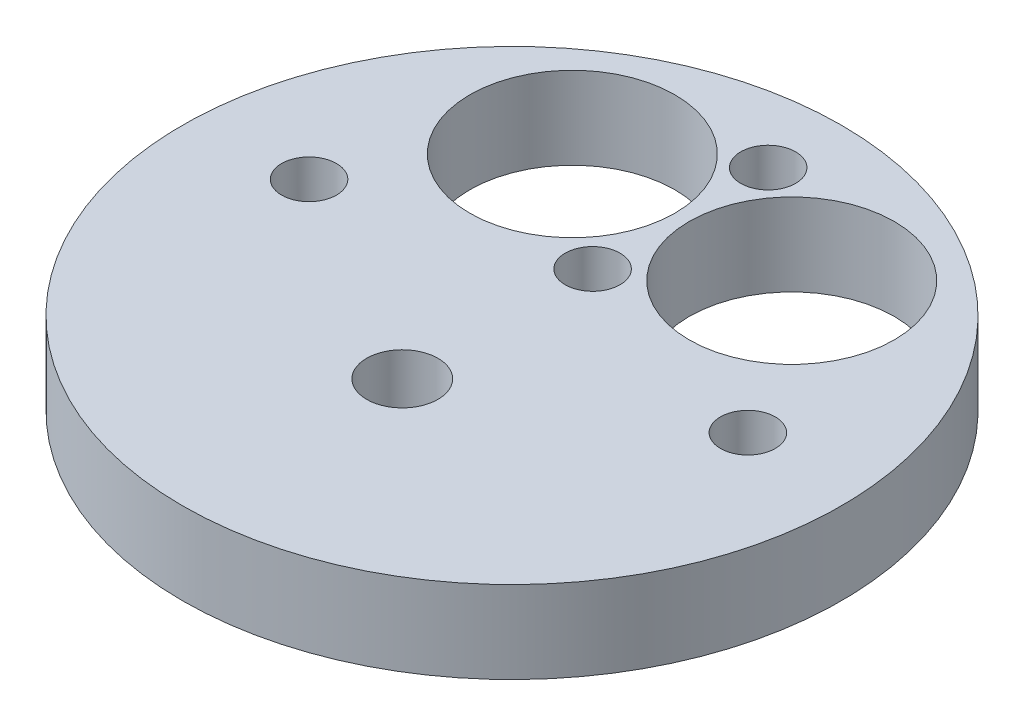
ISO-10303-21;
HEADER;
FILE_DESCRIPTION(('STEP AP214'),'2;1');
FILE_NAME('part.step','',(''),(''),'','','');
FILE_SCHEMA(('AUTOMOTIVE_DESIGN { 1 0 10303 214 1 1 1 1 }'));
ENDSEC;
DATA;
#1=APPLICATION_CONTEXT('core data for automotive mechanical design processes');
#2=APPLICATION_PROTOCOL_DEFINITION('international standard','automotive_design',2000,#1);
#3=PRODUCT_CONTEXT('',#1,'mechanical');
#4=PRODUCT('Part','Part','',(#3));
#5=PRODUCT_RELATED_PRODUCT_CATEGORY('part','',(#4));
#6=PRODUCT_DEFINITION_FORMATION('','',#4);
#7=PRODUCT_DEFINITION_CONTEXT('part definition',#1,'design');
#8=PRODUCT_DEFINITION('design','',#6,#7);
#9=PRODUCT_DEFINITION_SHAPE('','',#8);
#10=(LENGTH_UNIT() NAMED_UNIT(*) SI_UNIT(.MILLI.,.METRE.));
#11=(NAMED_UNIT(*) PLANE_ANGLE_UNIT() SI_UNIT($,.RADIAN.));
#12=(NAMED_UNIT(*) SI_UNIT($,.STERADIAN.) SOLID_ANGLE_UNIT());
#13=UNCERTAINTY_MEASURE_WITH_UNIT(LENGTH_MEASURE(1.E-05),#10,'distance_accuracy_value','');
#14=(GEOMETRIC_REPRESENTATION_CONTEXT(3) GLOBAL_UNCERTAINTY_ASSIGNED_CONTEXT((#13)) GLOBAL_UNIT_ASSIGNED_CONTEXT((#10,
#11,#12)) REPRESENTATION_CONTEXT('',''));
#15=CARTESIAN_POINT('',(0.,0.,0.));
#16=DIRECTION('',(0.,0.,1.));
#17=DIRECTION('',(1.,0.,0.));
#18=AXIS2_PLACEMENT_3D('',#15,#16,#17);
#19=CARTESIAN_POINT('',(0.,9.525,0.));
#20=DIRECTION('',(0.,-1.,0.));
#21=DIRECTION('',(0.,0.,-1.));
#22=AXIS2_PLACEMENT_3D('',#19,#20,#21);
#23=CYLINDRICAL_SURFACE('',#22,38.1508);
#24=CARTESIAN_POINT('',(0.,9.525,0.));
#25=DIRECTION('',(0.,1.,0.));
#26=DIRECTION('',(0.,0.,1.));
#27=AXIS2_PLACEMENT_3D('',#24,#25,#26);
#28=CIRCLE('',#27,38.1508);
#29=CARTESIAN_POINT('',(0.,9.525,-38.1508));
#30=VERTEX_POINT('',#29);
#31=EDGE_CURVE('E10',#30,#30,#28,.T.);
#32=CARTESIAN_POINT('',(0.,0.,0.));
#33=DIRECTION('',(0.,1.,0.));
#34=DIRECTION('',(0.,0.,1.));
#35=AXIS2_PLACEMENT_3D('',#32,#33,#34);
#36=CIRCLE('',#35,38.1508);
#37=CARTESIAN_POINT('',(0.,0.,-38.1508));
#38=VERTEX_POINT('',#37);
#39=EDGE_CURVE('E44',#38,#38,#36,.T.);
#40=CARTESIAN_POINT('',(0.,9.525,-38.1508));
#41=CARTESIAN_POINT('',(0.,9.42578125,-38.1508));
#42=CARTESIAN_POINT('',(0.,9.3265625,-38.1508));
#43=CARTESIAN_POINT('',(0.,9.128125,-38.1508));
#44=CARTESIAN_POINT('',(0.,9.02890625,-38.1508));
#45=CARTESIAN_POINT('',(0.,8.83046875,-38.1508));
#46=CARTESIAN_POINT('',(0.,8.73125,-38.1508));
#47=CARTESIAN_POINT('',(0.,8.5328125,-38.1508));
#48=CARTESIAN_POINT('',(0.,8.43359375,-38.1508));
#49=CARTESIAN_POINT('',(0.,8.23515625,-38.1508));
#50=CARTESIAN_POINT('',(0.,8.1359375,-38.1508));
#51=CARTESIAN_POINT('',(0.,7.9375,-38.1508));
#52=CARTESIAN_POINT('',(0.,7.83828125,-38.1508));
#53=CARTESIAN_POINT('',(0.,7.63984375,-38.1508));
#54=CARTESIAN_POINT('',(0.,7.540625,-38.1508));
#55=CARTESIAN_POINT('',(0.,7.3421875,-38.1508));
#56=CARTESIAN_POINT('',(0.,7.24296875,-38.1508));
#57=CARTESIAN_POINT('',(0.,7.04453125,-38.1508));
#58=CARTESIAN_POINT('',(0.,6.9453125,-38.1508));
#59=CARTESIAN_POINT('',(0.,6.746875,-38.1508));
#60=CARTESIAN_POINT('',(0.,6.64765625,-38.1508));
#61=CARTESIAN_POINT('',(0.,6.44921875,-38.1508));
#62=CARTESIAN_POINT('',(0.,6.35,-38.1508));
#63=CARTESIAN_POINT('',(0.,6.1515625,-38.1508));
#64=CARTESIAN_POINT('',(0.,6.05234375,-38.1508));
#65=CARTESIAN_POINT('',(0.,5.85390625,-38.1508));
#66=CARTESIAN_POINT('',(0.,5.7546875,-38.1508));
#67=CARTESIAN_POINT('',(0.,5.55625,-38.1508));
#68=CARTESIAN_POINT('',(0.,5.45703125,-38.1508));
#69=CARTESIAN_POINT('',(0.,5.25859375,-38.1508));
#70=CARTESIAN_POINT('',(0.,5.159375,-38.1508));
#71=CARTESIAN_POINT('',(0.,4.9609375,-38.1508));
#72=CARTESIAN_POINT('',(0.,4.86171875,-38.1508));
#73=CARTESIAN_POINT('',(0.,4.66328125,-38.1508));
#74=CARTESIAN_POINT('',(0.,4.5640625,-38.1508));
#75=CARTESIAN_POINT('',(0.,4.365625,-38.1508));
#76=CARTESIAN_POINT('',(0.,4.26640625,-38.1508));
#77=CARTESIAN_POINT('',(0.,4.06796875,-38.1508));
#78=CARTESIAN_POINT('',(0.,3.96875,-38.1508));
#79=CARTESIAN_POINT('',(0.,3.7703125,-38.1508));
#80=CARTESIAN_POINT('',(0.,3.67109375,-38.1508));
#81=CARTESIAN_POINT('',(0.,3.47265625,-38.1508));
#82=CARTESIAN_POINT('',(0.,3.3734375,-38.1508));
#83=CARTESIAN_POINT('',(0.,3.175,-38.1508));
#84=CARTESIAN_POINT('',(0.,3.07578125,-38.1508));
#85=CARTESIAN_POINT('',(0.,2.87734375,-38.1508));
#86=CARTESIAN_POINT('',(0.,2.778125,-38.1508));
#87=CARTESIAN_POINT('',(0.,2.5796875,-38.1508));
#88=CARTESIAN_POINT('',(0.,2.48046875,-38.1508));
#89=CARTESIAN_POINT('',(0.,2.28203125,-38.1508));
#90=CARTESIAN_POINT('',(0.,2.1828125,-38.1508));
#91=CARTESIAN_POINT('',(0.,1.984375,-38.1508));
#92=CARTESIAN_POINT('',(0.,1.88515625,-38.1508));
#93=CARTESIAN_POINT('',(0.,1.68671875,-38.1508));
#94=CARTESIAN_POINT('',(0.,1.5875,-38.1508));
#95=CARTESIAN_POINT('',(0.,1.3890625,-38.1508));
#96=CARTESIAN_POINT('',(0.,1.28984375,-38.1508));
#97=CARTESIAN_POINT('',(0.,1.09140625,-38.1508));
#98=CARTESIAN_POINT('',(0.,0.992187500000001,-38.1508));
#99=CARTESIAN_POINT('',(0.,0.793750000000001,-38.1508));
#100=CARTESIAN_POINT('',(0.,0.69453125,-38.1508));
#101=CARTESIAN_POINT('',(0.,0.49609375,-38.1508));
#102=CARTESIAN_POINT('',(0.,0.396875,-38.1508));
#103=CARTESIAN_POINT('',(0.,0.1984375,-38.1508));
#104=CARTESIAN_POINT('',(0.,0.0992187500000001,-38.1508));
#105=CARTESIAN_POINT('',(0.,0.,-38.1508));
#106=B_SPLINE_CURVE_WITH_KNOTS('',3,(#40,#41,#42,#43,#44,#45,#46,#47,#48,#49,#50,#51,#52,#53,
#54,#55,#56,#57,#58,#59,#60,#61,#62,#63,#64,#65,#66,#67,#68,#69,#70,#71,#72,#73,#74,#75,#76,#77,
#78,#79,#80,#81,#82,#83,#84,#85,#86,#87,#88,#89,#90,#91,#92,#93,#94,#95,#96,#97,#98,#99,#100,
#101,#102,#103,#104,#105),.UNSPECIFIED.,.F.,.F.,(4,2,2,2,2,2,2,2,2,2,2,2,2,2,2,2,2,2,2,2,2,2,2,
2,2,2,2,2,2,2,2,2,4),(0.,0.297656249999998,0.595312499999999,0.892968749999999,1.190625,
1.48828125,1.7859375,2.08359375,2.38125,2.67890625,2.9765625,3.27421875,3.571875,3.86953125,
4.1671875,4.46484375,4.7625,5.06015625,5.3578125,5.65546875,5.953125,6.25078125,6.5484375,
6.84609375,7.14375,7.44140625,7.7390625,8.03671875,8.334375,8.63203125,8.9296875,9.22734375,
9.525),.UNSPECIFIED.);
#107=EDGE_CURVE('BSEAM37',#30,#38,#106,.T.);
#108=ORIENTED_EDGE('',*,*,#31,.F.);
#109=ORIENTED_EDGE('',*,*,#39,.T.);
#110=ORIENTED_EDGE('',*,*,#107,.T.);
#111=ORIENTED_EDGE('',*,*,#107,.F.);
#112=EDGE_LOOP('',(#108,#110,#109,#111));
#113=FACE_BOUND('',#112,.T.);
#114=ADVANCED_FACE('F37',(#113),#23,.T.);
#115=CARTESIAN_POINT('',(0.,9.525,0.));
#116=DIRECTION('',(0.,1.,0.));
#117=DIRECTION('',(0.,0.,1.));
#118=AXIS2_PLACEMENT_3D('',#115,#116,#117);
#119=PLANE('',#118);
#120=CARTESIAN_POINT('',(0.,9.525,12.7));
#121=DIRECTION('',(0.,1.,0.));
#122=DIRECTION('',(0.,0.,1.));
#123=AXIS2_PLACEMENT_3D('',#120,#121,#122);
#124=CIRCLE('',#123,4.1275);
#125=CARTESIAN_POINT('',(0.,9.525,16.8275));
#126=VERTEX_POINT('',#125);
#127=EDGE_CURVE('E81',#126,#126,#124,.T.);
#128=ORIENTED_EDGE('',*,*,#127,.F.);
#129=EDGE_LOOP('',(#128));
#130=FACE_BOUND('',#129,.T.);
#131=CARTESIAN_POINT('',(25.4,9.525,-1.905));
#132=DIRECTION('',(0.,1.,0.));
#133=DIRECTION('',(0.,0.,1.));
#134=AXIS2_PLACEMENT_3D('',#131,#132,#133);
#135=CIRCLE('',#134,3.175);
#136=CARTESIAN_POINT('',(25.4,9.525,1.27));
#137=VERTEX_POINT('',#136);
#138=EDGE_CURVE('E67',#137,#137,#135,.T.);
#139=ORIENTED_EDGE('',*,*,#138,.F.);
#140=EDGE_LOOP('',(#139));
#141=FACE_BOUND('',#140,.T.);
#142=CARTESIAN_POINT('',(-25.4,9.525,-1.905));
#143=DIRECTION('',(0.,1.,0.));
#144=DIRECTION('',(0.,0.,-1.));
#145=AXIS2_PLACEMENT_3D('',#142,#143,#144);
#146=CIRCLE('',#145,3.175);
#147=CARTESIAN_POINT('',(-25.4,9.525,-5.08));
#148=VERTEX_POINT('',#147);
#149=EDGE_CURVE('E73',#148,#148,#146,.T.);
#150=ORIENTED_EDGE('',*,*,#149,.F.);
#151=EDGE_LOOP('',(#150));
#152=FACE_BOUND('',#151,.T.);
#153=CARTESIAN_POINT('',(0.,9.525,-29.6540115119919));
#154=DIRECTION('',(0.,1.,0.));
#155=DIRECTION('',(0.,0.,1.));
#156=AXIS2_PLACEMENT_3D('',#153,#154,#155);
#157=CIRCLE('',#156,3.175);
#158=CARTESIAN_POINT('',(0.,9.525,-26.4790115119919));
#159=VERTEX_POINT('',#158);
#160=EDGE_CURVE('E86',#159,#159,#157,.T.);
#161=ORIENTED_EDGE('',*,*,#160,.F.);
#162=EDGE_LOOP('',(#161));
#163=FACE_BOUND('',#162,.T.);
#164=CARTESIAN_POINT('',(12.7,9.525,-19.685));
#165=DIRECTION('',(0.,1.,0.));
#166=DIRECTION('',(0.,0.,1.));
#167=AXIS2_PLACEMENT_3D('',#164,#165,#166);
#168=CIRCLE('',#167,11.8745);
#169=CARTESIAN_POINT('',(12.7,9.525,-7.8105));
#170=VERTEX_POINT('',#169);
#171=EDGE_CURVE('E88',#170,#170,#168,.T.);
#172=ORIENTED_EDGE('',*,*,#171,.F.);
#173=EDGE_LOOP('',(#172));
#174=FACE_BOUND('',#173,.T.);
#175=CARTESIAN_POINT('',(0.,9.525,-9.33401151199186));
#176=DIRECTION('',(0.,1.,0.));
#177=DIRECTION('',(0.,0.,1.));
#178=AXIS2_PLACEMENT_3D('',#175,#176,#177);
#179=CIRCLE('',#178,3.175);
#180=CARTESIAN_POINT('',(0.,9.525,-6.15901151199185));
#181=VERTEX_POINT('',#180);
#182=EDGE_CURVE('E71',#181,#181,#179,.T.);
#183=ORIENTED_EDGE('',*,*,#182,.F.);
#184=EDGE_LOOP('',(#183));
#185=FACE_BOUND('',#184,.T.);
#186=CARTESIAN_POINT('',(-12.7,9.525,-19.685));
#187=DIRECTION('',(0.,1.,0.));
#188=DIRECTION('',(0.,0.,1.));
#189=AXIS2_PLACEMENT_3D('',#186,#187,#188);
#190=CIRCLE('',#189,11.8745);
#191=CARTESIAN_POINT('',(-12.7,9.525,-7.8105));
#192=VERTEX_POINT('',#191);
#193=EDGE_CURVE('E52',#192,#192,#190,.T.);
#194=ORIENTED_EDGE('',*,*,#193,.F.);
#195=EDGE_LOOP('',(#194));
#196=FACE_BOUND('',#195,.T.);
#197=ORIENTED_EDGE('',*,*,#31,.T.);
#198=EDGE_LOOP('',(#197));
#199=FACE_BOUND('',#198,.T.);
#200=ADVANCED_FACE('F98',(#130,#141,#152,#163,#174,#185,#196,#199),#119,.T.);
#201=CARTESIAN_POINT('',(0.,0.,0.));
#202=DIRECTION('',(0.,1.,0.));
#203=DIRECTION('',(0.,0.,1.));
#204=AXIS2_PLACEMENT_3D('',#201,#202,#203);
#205=PLANE('',#204);
#206=CARTESIAN_POINT('',(0.,0.,12.7));
#207=DIRECTION('',(0.,1.,0.));
#208=DIRECTION('',(0.,0.,1.));
#209=AXIS2_PLACEMENT_3D('',#206,#207,#208);
#210=CIRCLE('',#209,4.1275);
#211=CARTESIAN_POINT('',(0.,0.,16.8275));
#212=VERTEX_POINT('',#211);
#213=EDGE_CURVE('E78',#212,#212,#210,.T.);
#214=ORIENTED_EDGE('',*,*,#213,.T.);
#215=EDGE_LOOP('',(#214));
#216=FACE_BOUND('',#215,.T.);
#217=CARTESIAN_POINT('',(25.4,0.,-1.905));
#218=DIRECTION('',(0.,1.,0.));
#219=DIRECTION('',(0.,0.,1.));
#220=AXIS2_PLACEMENT_3D('',#217,#218,#219);
#221=CIRCLE('',#220,3.175);
#222=CARTESIAN_POINT('',(25.4,0.,1.27));
#223=VERTEX_POINT('',#222);
#224=EDGE_CURVE('E40',#223,#223,#221,.T.);
#225=ORIENTED_EDGE('',*,*,#224,.T.);
#226=EDGE_LOOP('',(#225));
#227=FACE_BOUND('',#226,.T.);
#228=CARTESIAN_POINT('',(-25.4,0.,-1.905));
#229=DIRECTION('',(0.,1.,0.));
#230=DIRECTION('',(0.,0.,1.));
#231=AXIS2_PLACEMENT_3D('',#228,#229,#230);
#232=CIRCLE('',#231,3.175);
#233=CARTESIAN_POINT('',(-25.4,0.,1.27));
#234=VERTEX_POINT('',#233);
#235=EDGE_CURVE('E65',#234,#234,#232,.T.);
#236=ORIENTED_EDGE('',*,*,#235,.T.);
#237=EDGE_LOOP('',(#236));
#238=FACE_BOUND('',#237,.T.);
#239=CARTESIAN_POINT('',(0.,0.,-29.6540115119919));
#240=DIRECTION('',(0.,1.,0.));
#241=DIRECTION('',(0.,0.,1.));
#242=AXIS2_PLACEMENT_3D('',#239,#240,#241);
#243=CIRCLE('',#242,3.175);
#244=CARTESIAN_POINT('',(0.,0.,-26.4790115119919));
#245=VERTEX_POINT('',#244);
#246=EDGE_CURVE('E49',#245,#245,#243,.T.);
#247=ORIENTED_EDGE('',*,*,#246,.T.);
#248=EDGE_LOOP('',(#247));
#249=FACE_BOUND('',#248,.T.);
#250=CARTESIAN_POINT('',(12.7,0.,-19.685));
#251=DIRECTION('',(0.,1.,0.));
#252=DIRECTION('',(0.,0.,1.));
#253=AXIS2_PLACEMENT_3D('',#250,#251,#252);
#254=CIRCLE('',#253,11.8745);
#255=CARTESIAN_POINT('',(12.7,0.,-7.8105));
#256=VERTEX_POINT('',#255);
#257=EDGE_CURVE('E61',#256,#256,#254,.T.);
#258=ORIENTED_EDGE('',*,*,#257,.T.);
#259=EDGE_LOOP('',(#258));
#260=FACE_BOUND('',#259,.T.);
#261=CARTESIAN_POINT('',(0.,0.,-9.33401151199186));
#262=DIRECTION('',(0.,1.,0.));
#263=DIRECTION('',(0.,0.,1.));
#264=AXIS2_PLACEMENT_3D('',#261,#262,#263);
#265=CIRCLE('',#264,3.175);
#266=CARTESIAN_POINT('',(0.,0.,-6.15901151199185));
#267=VERTEX_POINT('',#266);
#268=EDGE_CURVE('E58',#267,#267,#265,.T.);
#269=ORIENTED_EDGE('',*,*,#268,.T.);
#270=EDGE_LOOP('',(#269));
#271=FACE_BOUND('',#270,.T.);
#272=CARTESIAN_POINT('',(-12.7,0.,-19.685));
#273=DIRECTION('',(0.,1.,0.));
#274=DIRECTION('',(0.,0.,1.));
#275=AXIS2_PLACEMENT_3D('',#272,#273,#274);
#276=CIRCLE('',#275,11.8745);
#277=CARTESIAN_POINT('',(-12.7,0.,-7.8105));
#278=VERTEX_POINT('',#277);
#279=EDGE_CURVE('E55',#278,#278,#276,.T.);
#280=ORIENTED_EDGE('',*,*,#279,.T.);
#281=EDGE_LOOP('',(#280));
#282=FACE_BOUND('',#281,.T.);
#283=ORIENTED_EDGE('',*,*,#39,.F.);
#284=EDGE_LOOP('',(#283));
#285=FACE_BOUND('',#284,.T.);
#286=ADVANCED_FACE('F100',(#216,#227,#238,#249,#260,#271,#282,#285),#205,.F.);
#287=CARTESIAN_POINT('',(-12.7,-7.239,-19.685));
#288=DIRECTION('',(0.,1.,0.));
#289=DIRECTION('',(0.,0.,1.));
#290=AXIS2_PLACEMENT_3D('',#287,#288,#289);
#291=CYLINDRICAL_SURFACE('',#290,11.8745);
#292=ORIENTED_EDGE('',*,*,#193,.T.);
#293=EDGE_LOOP('',(#292));
#294=FACE_BOUND('',#293,.T.);
#295=ORIENTED_EDGE('',*,*,#279,.F.);
#296=EDGE_LOOP('',(#295));
#297=FACE_BOUND('',#296,.T.);
#298=ADVANCED_FACE('F95',(#294,#297),#291,.F.);
#299=CARTESIAN_POINT('',(0.,-7.239,-9.33401151199186));
#300=DIRECTION('',(0.,1.,0.));
#301=DIRECTION('',(0.,0.,1.));
#302=AXIS2_PLACEMENT_3D('',#299,#300,#301);
#303=CYLINDRICAL_SURFACE('',#302,3.175);
#304=ORIENTED_EDGE('',*,*,#182,.T.);
#305=EDGE_LOOP('',(#304));
#306=FACE_BOUND('',#305,.T.);
#307=ORIENTED_EDGE('',*,*,#268,.F.);
#308=EDGE_LOOP('',(#307));
#309=FACE_BOUND('',#308,.T.);
#310=ADVANCED_FACE('F115',(#306,#309),#303,.F.);
#311=CARTESIAN_POINT('',(12.7,-7.239,-19.685));
#312=DIRECTION('',(0.,1.,0.));
#313=DIRECTION('',(0.,0.,1.));
#314=AXIS2_PLACEMENT_3D('',#311,#312,#313);
#315=CYLINDRICAL_SURFACE('',#314,11.8745);
#316=ORIENTED_EDGE('',*,*,#171,.T.);
#317=EDGE_LOOP('',(#316));
#318=FACE_BOUND('',#317,.T.);
#319=ORIENTED_EDGE('',*,*,#257,.F.);
#320=EDGE_LOOP('',(#319));
#321=FACE_BOUND('',#320,.T.);
#322=ADVANCED_FACE('F116',(#318,#321),#315,.F.);
#323=CARTESIAN_POINT('',(0.,-7.239,-29.6540115119919));
#324=DIRECTION('',(0.,1.,0.));
#325=DIRECTION('',(0.,0.,1.));
#326=AXIS2_PLACEMENT_3D('',#323,#324,#325);
#327=CYLINDRICAL_SURFACE('',#326,3.175);
#328=ORIENTED_EDGE('',*,*,#160,.T.);
#329=EDGE_LOOP('',(#328));
#330=FACE_BOUND('',#329,.T.);
#331=ORIENTED_EDGE('',*,*,#246,.F.);
#332=EDGE_LOOP('',(#331));
#333=FACE_BOUND('',#332,.T.);
#334=ADVANCED_FACE('F119',(#330,#333),#327,.F.);
#335=CARTESIAN_POINT('',(-25.4,-7.239,-1.905));
#336=DIRECTION('',(0.,1.,0.));
#337=DIRECTION('',(0.,0.,1.));
#338=AXIS2_PLACEMENT_3D('',#335,#336,#337);
#339=CYLINDRICAL_SURFACE('',#338,3.175);
#340=ORIENTED_EDGE('',*,*,#149,.T.);
#341=EDGE_LOOP('',(#340));
#342=FACE_BOUND('',#341,.T.);
#343=ORIENTED_EDGE('',*,*,#235,.F.);
#344=EDGE_LOOP('',(#343));
#345=FACE_BOUND('',#344,.T.);
#346=ADVANCED_FACE('F122',(#342,#345),#339,.F.);
#347=CARTESIAN_POINT('',(25.4,-7.239,-1.905));
#348=DIRECTION('',(0.,1.,0.));
#349=DIRECTION('',(0.,0.,1.));
#350=AXIS2_PLACEMENT_3D('',#347,#348,#349);
#351=CYLINDRICAL_SURFACE('',#350,3.175);
#352=ORIENTED_EDGE('',*,*,#138,.T.);
#353=EDGE_LOOP('',(#352));
#354=FACE_BOUND('',#353,.T.);
#355=ORIENTED_EDGE('',*,*,#224,.F.);
#356=EDGE_LOOP('',(#355));
#357=FACE_BOUND('',#356,.T.);
#358=ADVANCED_FACE('F129',(#354,#357),#351,.F.);
#359=CARTESIAN_POINT('',(0.,0.,12.7));
#360=DIRECTION('',(0.,1.,0.));
#361=DIRECTION('',(0.,0.,1.));
#362=AXIS2_PLACEMENT_3D('',#359,#360,#361);
#363=CYLINDRICAL_SURFACE('',#362,4.1275);
#364=CARTESIAN_POINT('',(0.,0.,16.8275));
#365=CARTESIAN_POINT('',(0.,0.0992187499999999,16.8275));
#366=CARTESIAN_POINT('',(0.,0.1984375,16.8275));
#367=CARTESIAN_POINT('',(0.,0.396875,16.8275));
#368=CARTESIAN_POINT('',(0.,0.49609375,16.8275));
#369=CARTESIAN_POINT('',(0.,0.69453125,16.8275));
#370=CARTESIAN_POINT('',(0.,0.79375,16.8275));
#371=CARTESIAN_POINT('',(0.,0.9921875,16.8275));
#372=CARTESIAN_POINT('',(0.,1.09140625,16.8275));
#373=CARTESIAN_POINT('',(0.,1.28984375,16.8275));
#374=CARTESIAN_POINT('',(0.,1.3890625,16.8275));
#375=CARTESIAN_POINT('',(0.,1.5875,16.8275));
#376=CARTESIAN_POINT('',(0.,1.68671875,16.8275));
#377=CARTESIAN_POINT('',(0.,1.88515625,16.8275));
#378=CARTESIAN_POINT('',(0.,1.984375,16.8275));
#379=CARTESIAN_POINT('',(0.,2.1828125,16.8275));
#380=CARTESIAN_POINT('',(0.,2.28203125,16.8275));
#381=CARTESIAN_POINT('',(0.,2.48046875,16.8275));
#382=CARTESIAN_POINT('',(0.,2.5796875,16.8275));
#383=CARTESIAN_POINT('',(0.,2.778125,16.8275));
#384=CARTESIAN_POINT('',(0.,2.87734375,16.8275));
#385=CARTESIAN_POINT('',(0.,3.07578125,16.8275));
#386=CARTESIAN_POINT('',(0.,3.175,16.8275));
#387=CARTESIAN_POINT('',(0.,3.3734375,16.8275));
#388=CARTESIAN_POINT('',(0.,3.47265625,16.8275));
#389=CARTESIAN_POINT('',(0.,3.67109375,16.8275));
#390=CARTESIAN_POINT('',(0.,3.7703125,16.8275));
#391=CARTESIAN_POINT('',(0.,3.96875,16.8275));
#392=CARTESIAN_POINT('',(0.,4.06796875,16.8275));
#393=CARTESIAN_POINT('',(0.,4.26640625,16.8275));
#394=CARTESIAN_POINT('',(0.,4.365625,16.8275));
#395=CARTESIAN_POINT('',(0.,4.5640625,16.8275));
#396=CARTESIAN_POINT('',(0.,4.66328125,16.8275));
#397=CARTESIAN_POINT('',(0.,4.86171875,16.8275));
#398=CARTESIAN_POINT('',(0.,4.9609375,16.8275));
#399=CARTESIAN_POINT('',(0.,5.159375,16.8275));
#400=CARTESIAN_POINT('',(0.,5.25859375,16.8275));
#401=CARTESIAN_POINT('',(0.,5.45703125,16.8275));
#402=CARTESIAN_POINT('',(0.,5.55625,16.8275));
#403=CARTESIAN_POINT('',(0.,5.7546875,16.8275));
#404=CARTESIAN_POINT('',(0.,5.85390625,16.8275));
#405=CARTESIAN_POINT('',(0.,6.05234375,16.8275));
#406=CARTESIAN_POINT('',(0.,6.1515625,16.8275));
#407=CARTESIAN_POINT('',(0.,6.35,16.8275));
#408=CARTESIAN_POINT('',(0.,6.44921875,16.8275));
#409=CARTESIAN_POINT('',(0.,6.64765625,16.8275));
#410=CARTESIAN_POINT('',(0.,6.746875,16.8275));
#411=CARTESIAN_POINT('',(0.,6.9453125,16.8275));
#412=CARTESIAN_POINT('',(0.,7.04453125,16.8275));
#413=CARTESIAN_POINT('',(0.,7.24296875,16.8275));
#414=CARTESIAN_POINT('',(0.,7.3421875,16.8275));
#415=CARTESIAN_POINT('',(0.,7.540625,16.8275));
#416=CARTESIAN_POINT('',(0.,7.63984375,16.8275));
#417=CARTESIAN_POINT('',(0.,7.83828125,16.8275));
#418=CARTESIAN_POINT('',(0.,7.9375,16.8275));
#419=CARTESIAN_POINT('',(0.,8.1359375,16.8275));
#420=CARTESIAN_POINT('',(0.,8.23515625,16.8275));
#421=CARTESIAN_POINT('',(0.,8.43359375,16.8275));
#422=CARTESIAN_POINT('',(0.,8.5328125,16.8275));
#423=CARTESIAN_POINT('',(0.,8.73125,16.8275));
#424=CARTESIAN_POINT('',(0.,8.83046875,16.8275));
#425=CARTESIAN_POINT('',(0.,9.02890625,16.8275));
#426=CARTESIAN_POINT('',(0.,9.128125,16.8275));
#427=CARTESIAN_POINT('',(0.,9.3265625,16.8275));
#428=CARTESIAN_POINT('',(0.,9.42578125,16.8275));
#429=CARTESIAN_POINT('',(0.,9.525,16.8275));
#430=B_SPLINE_CURVE_WITH_KNOTS('',3,(#364,#365,#366,#367,#368,#369,#370,#371,#372,#373,#374,
#375,#376,#377,#378,#379,#380,#381,#382,#383,#384,#385,#386,#387,#388,#389,#390,#391,#392,#393,
#394,#395,#396,#397,#398,#399,#400,#401,#402,#403,#404,#405,#406,#407,#408,#409,#410,#411,#412,
#413,#414,#415,#416,#417,#418,#419,#420,#421,#422,#423,#424,#425,#426,#427,#428,#429),
.UNSPECIFIED.,.F.,.F.,(4,2,2,2,2,2,2,2,2,2,2,2,2,2,2,2,2,2,2,2,2,2,2,2,2,2,2,2,2,2,2,2,4),(0.,
0.29765625,0.5953125,0.89296875,1.190625,1.48828125,1.7859375,2.08359375,2.38125,2.67890625,
2.9765625,3.27421875,3.571875,3.86953125,4.1671875,4.46484375,4.7625,5.06015625,5.3578125,
5.65546875,5.953125,6.25078125,6.5484375,6.84609375,7.14375,7.44140625,7.7390625,8.03671875,
8.334375,8.63203125,8.9296875,9.22734375,9.525),.UNSPECIFIED.);
#431=EDGE_CURVE('BSEAM133',#212,#126,#430,.T.);
#432=ORIENTED_EDGE('',*,*,#213,.F.);
#433=ORIENTED_EDGE('',*,*,#127,.T.);
#434=ORIENTED_EDGE('',*,*,#431,.T.);
#435=ORIENTED_EDGE('',*,*,#431,.F.);
#436=EDGE_LOOP('',(#432,#434,#433,#435));
#437=FACE_BOUND('',#436,.T.);
#438=ADVANCED_FACE('F133',(#437),#363,.F.);
#439=CLOSED_SHELL('',(#114,#200,#286,#298,#310,#322,#334,#346,#358,#438));
#440=MANIFOLD_SOLID_BREP('B2',#439);
#441=ADVANCED_BREP_SHAPE_REPRESENTATION('',(#18,#440),#14);
#442=SHAPE_DEFINITION_REPRESENTATION(#9,#441);
ENDSEC;
END-ISO-10303-21;
